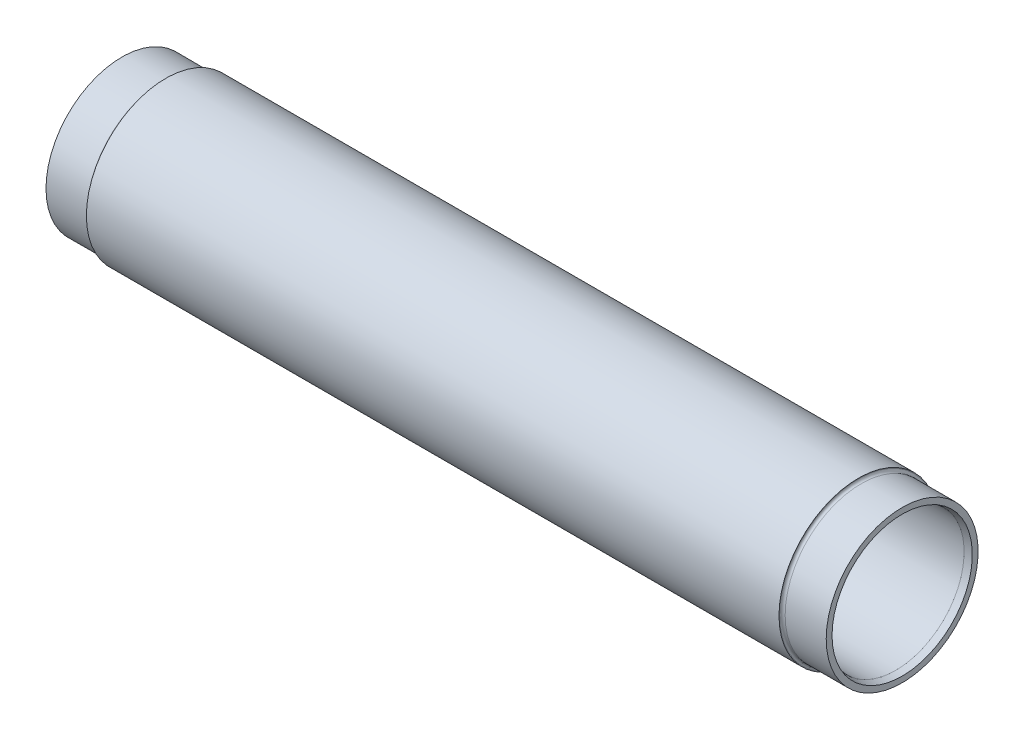
ISO-10303-21;
HEADER;
FILE_DESCRIPTION(('STEP AP214'),'2;1');
FILE_NAME('part.step','',(''),(''),'','','');
FILE_SCHEMA(('AUTOMOTIVE_DESIGN { 1 0 10303 214 1 1 1 1 }'));
ENDSEC;
DATA;
#1=APPLICATION_CONTEXT('core data for automotive mechanical design processes');
#2=APPLICATION_PROTOCOL_DEFINITION('international standard','automotive_design',2000,#1);
#3=PRODUCT_CONTEXT('',#1,'mechanical');
#4=PRODUCT('Part','Part','',(#3));
#5=PRODUCT_RELATED_PRODUCT_CATEGORY('part','',(#4));
#6=PRODUCT_DEFINITION_FORMATION('','',#4);
#7=PRODUCT_DEFINITION_CONTEXT('part definition',#1,'design');
#8=PRODUCT_DEFINITION('design','',#6,#7);
#9=PRODUCT_DEFINITION_SHAPE('','',#8);
#10=(LENGTH_UNIT() NAMED_UNIT(*) SI_UNIT(.MILLI.,.METRE.));
#11=(NAMED_UNIT(*) PLANE_ANGLE_UNIT() SI_UNIT($,.RADIAN.));
#12=(NAMED_UNIT(*) SI_UNIT($,.STERADIAN.) SOLID_ANGLE_UNIT());
#13=UNCERTAINTY_MEASURE_WITH_UNIT(LENGTH_MEASURE(1.E-05),#10,'distance_accuracy_value','');
#14=(GEOMETRIC_REPRESENTATION_CONTEXT(3) GLOBAL_UNCERTAINTY_ASSIGNED_CONTEXT((#13)) GLOBAL_UNIT_ASSIGNED_CONTEXT((#10,
#11,#12)) REPRESENTATION_CONTEXT('',''));
#15=CARTESIAN_POINT('',(0.,0.,0.));
#16=DIRECTION('',(0.,0.,1.));
#17=DIRECTION('',(1.,0.,0.));
#18=AXIS2_PLACEMENT_3D('',#15,#16,#17);
#19=CARTESIAN_POINT('',(0.,0.,0.));
#20=DIRECTION('',(-1.,0.,0.));
#21=DIRECTION('',(0.,0.,1.));
#22=AXIS2_PLACEMENT_3D('',#19,#20,#21);
#23=CONICAL_SURFACE('',#22,51.25,0.257323714971089);
#24=CARTESIAN_POINT('',(4.75,0.,0.));
#25=DIRECTION('',(-1.,0.,0.));
#26=DIRECTION('',(0.,0.,1.));
#27=AXIS2_PLACEMENT_3D('',#24,#25,#26);
#28=CIRCLE('',#27,50.);
#29=CARTESIAN_POINT('',(4.75,0.,50.));
#30=VERTEX_POINT('',#29);
#31=EDGE_CURVE('E95',#30,#30,#28,.T.);
#32=ORIENTED_EDGE('',*,*,#31,.F.);
#33=EDGE_LOOP('',(#32));
#34=FACE_BOUND('',#33,.T.);
#35=CARTESIAN_POINT('',(0.,0.,0.));
#36=DIRECTION('',(-1.,0.,0.));
#37=DIRECTION('',(0.,0.,1.));
#38=AXIS2_PLACEMENT_3D('',#35,#36,#37);
#39=CIRCLE('',#38,51.25);
#40=CARTESIAN_POINT('',(0.,0.,51.25));
#41=VERTEX_POINT('',#40);
#42=EDGE_CURVE('E67',#41,#41,#39,.T.);
#43=ORIENTED_EDGE('',*,*,#42,.T.);
#44=EDGE_LOOP('',(#43));
#45=FACE_BOUND('',#44,.T.);
#46=ADVANCED_FACE('F43',(#34,#45),#23,.F.);
#47=CARTESIAN_POINT('',(0.,0.,-51.25));
#48=DIRECTION('',(1.,0.,0.));
#49=DIRECTION('',(0.,0.,-1.));
#50=AXIS2_PLACEMENT_3D('',#47,#48,#49);
#51=PLANE('',#50);
#52=ORIENTED_EDGE('',*,*,#42,.F.);
#53=EDGE_LOOP('',(#52));
#54=FACE_BOUND('',#53,.T.);
#55=CARTESIAN_POINT('',(0.,0.,0.));
#56=DIRECTION('',(-1.,0.,0.));
#57=DIRECTION('',(0.,0.,1.));
#58=AXIS2_PLACEMENT_3D('',#55,#56,#57);
#59=CIRCLE('',#58,55.5);
#60=CARTESIAN_POINT('',(0.,0.,55.5));
#61=VERTEX_POINT('',#60);
#62=EDGE_CURVE('E71',#61,#61,#59,.T.);
#63=ORIENTED_EDGE('',*,*,#62,.T.);
#64=EDGE_LOOP('',(#63));
#65=FACE_BOUND('',#64,.T.);
#66=ADVANCED_FACE('F104',(#54,#65),#51,.F.);
#67=CARTESIAN_POINT('',(0.,0.,0.));
#68=DIRECTION('',(-1.,0.,0.));
#69=DIRECTION('',(0.,0.,1.));
#70=AXIS2_PLACEMENT_3D('',#67,#68,#69);
#71=CYLINDRICAL_SURFACE('',#70,55.5);
#72=CARTESIAN_POINT('',(30.,0.,0.));
#73=DIRECTION('',(1.,0.,0.));
#74=DIRECTION('',(0.,0.,-1.));
#75=AXIS2_PLACEMENT_3D('',#72,#73,#74);
#76=CIRCLE('',#75,55.5);
#77=CARTESIAN_POINT('',(30.,0.,-55.5));
#78=VERTEX_POINT('',#77);
#79=EDGE_CURVE('E51',#78,#78,#76,.F.);
#80=ORIENTED_EDGE('',*,*,#79,.T.);
#81=EDGE_LOOP('',(#80));
#82=FACE_BOUND('',#81,.T.);
#83=ORIENTED_EDGE('',*,*,#62,.F.);
#84=EDGE_LOOP('',(#83));
#85=FACE_BOUND('',#84,.T.);
#86=ADVANCED_FACE('F110',(#82,#85),#71,.T.);
#87=CARTESIAN_POINT('',(32.,0.,-55.5));
#88=DIRECTION('',(1.,0.,0.));
#89=DIRECTION('',(0.,0.,-1.));
#90=AXIS2_PLACEMENT_3D('',#87,#88,#89);
#91=PLANE('',#90);
#92=CARTESIAN_POINT('',(32.,0.,0.));
#93=DIRECTION('',(1.,0.,0.));
#94=DIRECTION('',(0.,0.,-1.));
#95=AXIS2_PLACEMENT_3D('',#92,#93,#94);
#96=CIRCLE('',#95,57.5);
#97=CARTESIAN_POINT('',(32.,0.,-57.5));
#98=VERTEX_POINT('',#97);
#99=EDGE_CURVE('E10',#98,#98,#96,.T.);
#100=ORIENTED_EDGE('',*,*,#99,.T.);
#101=EDGE_LOOP('',(#100));
#102=FACE_BOUND('',#101,.T.);
#103=CARTESIAN_POINT('',(32.,0.,0.));
#104=DIRECTION('',(-1.,0.,0.));
#105=DIRECTION('',(0.,0.,1.));
#106=AXIS2_PLACEMENT_3D('',#103,#104,#105);
#107=CIRCLE('',#106,58.);
#108=CARTESIAN_POINT('',(32.,0.,58.));
#109=VERTEX_POINT('',#108);
#110=EDGE_CURVE('E75',#109,#109,#107,.T.);
#111=ORIENTED_EDGE('',*,*,#110,.T.);
#112=EDGE_LOOP('',(#111));
#113=FACE_BOUND('',#112,.T.);
#114=ADVANCED_FACE('F115',(#102,#113),#91,.F.);
#115=CARTESIAN_POINT('',(0.,0.,0.));
#116=DIRECTION('',(-1.,0.,0.));
#117=DIRECTION('',(0.,0.,1.));
#118=AXIS2_PLACEMENT_3D('',#115,#116,#117);
#119=CYLINDRICAL_SURFACE('',#118,58.);
#120=ORIENTED_EDGE('',*,*,#110,.F.);
#121=EDGE_LOOP('',(#120));
#122=FACE_BOUND('',#121,.T.);
#123=CARTESIAN_POINT('',(538.,0.,0.));
#124=DIRECTION('',(-1.,0.,0.));
#125=DIRECTION('',(0.,0.,1.));
#126=AXIS2_PLACEMENT_3D('',#123,#124,#125);
#127=CIRCLE('',#126,58.);
#128=CARTESIAN_POINT('',(538.,0.,58.));
#129=VERTEX_POINT('',#128);
#130=EDGE_CURVE('E79',#129,#129,#127,.T.);
#131=ORIENTED_EDGE('',*,*,#130,.T.);
#132=EDGE_LOOP('',(#131));
#133=FACE_BOUND('',#132,.T.);
#134=ADVANCED_FACE('F120',(#122,#133),#119,.T.);
#135=CARTESIAN_POINT('',(538.,0.,-58.));
#136=DIRECTION('',(-1.,0.,0.));
#137=DIRECTION('',(0.,0.,1.));
#138=AXIS2_PLACEMENT_3D('',#135,#136,#137);
#139=PLANE('',#138);
#140=CARTESIAN_POINT('',(538.,0.,0.));
#141=DIRECTION('',(-1.,0.,0.));
#142=DIRECTION('',(0.,0.,1.));
#143=AXIS2_PLACEMENT_3D('',#140,#141,#142);
#144=CIRCLE('',#143,57.5000000000001);
#145=CARTESIAN_POINT('',(538.,0.,57.5000000000001));
#146=VERTEX_POINT('',#145);
#147=EDGE_CURVE('E61',#146,#146,#144,.T.);
#148=ORIENTED_EDGE('',*,*,#147,.T.);
#149=EDGE_LOOP('',(#148));
#150=FACE_BOUND('',#149,.T.);
#151=ORIENTED_EDGE('',*,*,#130,.F.);
#152=EDGE_LOOP('',(#151));
#153=FACE_BOUND('',#152,.T.);
#154=ADVANCED_FACE('F138',(#150,#153),#139,.F.);
#155=CARTESIAN_POINT('',(0.,0.,0.));
#156=DIRECTION('',(-1.,0.,0.));
#157=DIRECTION('',(0.,0.,1.));
#158=AXIS2_PLACEMENT_3D('',#155,#156,#157);
#159=CYLINDRICAL_SURFACE('',#158,55.5000000000001);
#160=CARTESIAN_POINT('',(540.,0.,0.));
#161=DIRECTION('',(-1.,0.,0.));
#162=DIRECTION('',(0.,0.,1.));
#163=AXIS2_PLACEMENT_3D('',#160,#161,#162);
#164=CIRCLE('',#163,55.5000000000001);
#165=CARTESIAN_POINT('',(540.,0.,55.5000000000001));
#166=VERTEX_POINT('',#165);
#167=EDGE_CURVE('E56',#166,#166,#164,.F.);
#168=ORIENTED_EDGE('',*,*,#167,.T.);
#169=EDGE_LOOP('',(#168));
#170=FACE_BOUND('',#169,.T.);
#171=CARTESIAN_POINT('',(570.,0.,0.));
#172=DIRECTION('',(-1.,0.,0.));
#173=DIRECTION('',(0.,0.,1.));
#174=AXIS2_PLACEMENT_3D('',#171,#172,#173);
#175=CIRCLE('',#174,55.5000000000001);
#176=CARTESIAN_POINT('',(570.,0.,55.5000000000001));
#177=VERTEX_POINT('',#176);
#178=EDGE_CURVE('E83',#177,#177,#175,.T.);
#179=ORIENTED_EDGE('',*,*,#178,.T.);
#180=EDGE_LOOP('',(#179));
#181=FACE_BOUND('',#180,.T.);
#182=ADVANCED_FACE('F141',(#170,#181),#159,.T.);
#183=CARTESIAN_POINT('',(570.,0.,-55.5000000000001));
#184=DIRECTION('',(-1.,0.,0.));
#185=DIRECTION('',(0.,0.,1.));
#186=AXIS2_PLACEMENT_3D('',#183,#184,#185);
#187=PLANE('',#186);
#188=ORIENTED_EDGE('',*,*,#178,.F.);
#189=EDGE_LOOP('',(#188));
#190=FACE_BOUND('',#189,.T.);
#191=CARTESIAN_POINT('',(570.,0.,0.));
#192=DIRECTION('',(-1.,0.,0.));
#193=DIRECTION('',(0.,0.,1.));
#194=AXIS2_PLACEMENT_3D('',#191,#192,#193);
#195=CIRCLE('',#194,51.2500000000001);
#196=CARTESIAN_POINT('',(570.,0.,51.2500000000001));
#197=VERTEX_POINT('',#196);
#198=EDGE_CURVE('E87',#197,#197,#195,.T.);
#199=ORIENTED_EDGE('',*,*,#198,.T.);
#200=EDGE_LOOP('',(#199));
#201=FACE_BOUND('',#200,.T.);
#202=ADVANCED_FACE('F153',(#190,#201),#187,.F.);
#203=CARTESIAN_POINT('',(565.25,0.,0.));
#204=DIRECTION('',(1.,0.,0.));
#205=DIRECTION('',(0.,0.,-1.));
#206=AXIS2_PLACEMENT_3D('',#203,#204,#205);
#207=CONICAL_SURFACE('',#206,50.0000000000001,0.257323714971087);
#208=ORIENTED_EDGE('',*,*,#198,.F.);
#209=EDGE_LOOP('',(#208));
#210=FACE_BOUND('',#209,.T.);
#211=CARTESIAN_POINT('',(565.25,0.,0.));
#212=DIRECTION('',(-1.,0.,0.));
#213=DIRECTION('',(0.,0.,1.));
#214=AXIS2_PLACEMENT_3D('',#211,#212,#213);
#215=CIRCLE('',#214,50.0000000000001);
#216=CARTESIAN_POINT('',(565.25,0.,50.0000000000001));
#217=VERTEX_POINT('',#216);
#218=EDGE_CURVE('E91',#217,#217,#215,.T.);
#219=ORIENTED_EDGE('',*,*,#218,.T.);
#220=EDGE_LOOP('',(#219));
#221=FACE_BOUND('',#220,.T.);
#222=ADVANCED_FACE('F131',(#210,#221),#207,.F.);
#223=CARTESIAN_POINT('',(0.,0.,0.));
#224=DIRECTION('',(-1.,0.,0.));
#225=DIRECTION('',(0.,0.,1.));
#226=AXIS2_PLACEMENT_3D('',#223,#224,#225);
#227=CYLINDRICAL_SURFACE('',#226,50.);
#228=ORIENTED_EDGE('',*,*,#218,.F.);
#229=EDGE_LOOP('',(#228));
#230=FACE_BOUND('',#229,.T.);
#231=ORIENTED_EDGE('',*,*,#31,.T.);
#232=EDGE_LOOP('',(#231));
#233=FACE_BOUND('',#232,.T.);
#234=ADVANCED_FACE('F100',(#230,#233),#227,.F.);
#235=CARTESIAN_POINT('',(540.,0.,0.));
#236=DIRECTION('',(-1.,0.,0.));
#237=DIRECTION('',(0.,0.,1.));
#238=AXIS2_PLACEMENT_3D('',#235,#236,#237);
#239=TOROIDAL_SURFACE('',#238,57.5000000000001,2.);
#240=ORIENTED_EDGE('',*,*,#167,.F.);
#241=EDGE_LOOP('',(#240));
#242=FACE_BOUND('',#241,.T.);
#243=ORIENTED_EDGE('',*,*,#147,.F.);
#244=EDGE_LOOP('',(#243));
#245=FACE_BOUND('',#244,.T.);
#246=ADVANCED_FACE('F123',(#242,#245),#239,.F.);
#247=CARTESIAN_POINT('',(30.,0.,0.));
#248=DIRECTION('',(1.,0.,0.));
#249=DIRECTION('',(0.,0.,-1.));
#250=AXIS2_PLACEMENT_3D('',#247,#248,#249);
#251=TOROIDAL_SURFACE('',#250,57.5,2.);
#252=ORIENTED_EDGE('',*,*,#99,.F.);
#253=EDGE_LOOP('',(#252));
#254=FACE_BOUND('',#253,.T.);
#255=ORIENTED_EDGE('',*,*,#79,.F.);
#256=EDGE_LOOP('',(#255));
#257=FACE_BOUND('',#256,.T.);
#258=ADVANCED_FACE('F45',(#254,#257),#251,.F.);
#259=CLOSED_SHELL('',(#46,#66,#86,#114,#134,#154,#182,#202,#222,#234,#246,#258));
#260=MANIFOLD_SOLID_BREP('B2',#259);
#261=ADVANCED_BREP_SHAPE_REPRESENTATION('',(#18,#260),#14);
#262=SHAPE_DEFINITION_REPRESENTATION(#9,#261);
ENDSEC;
END-ISO-10303-21;
